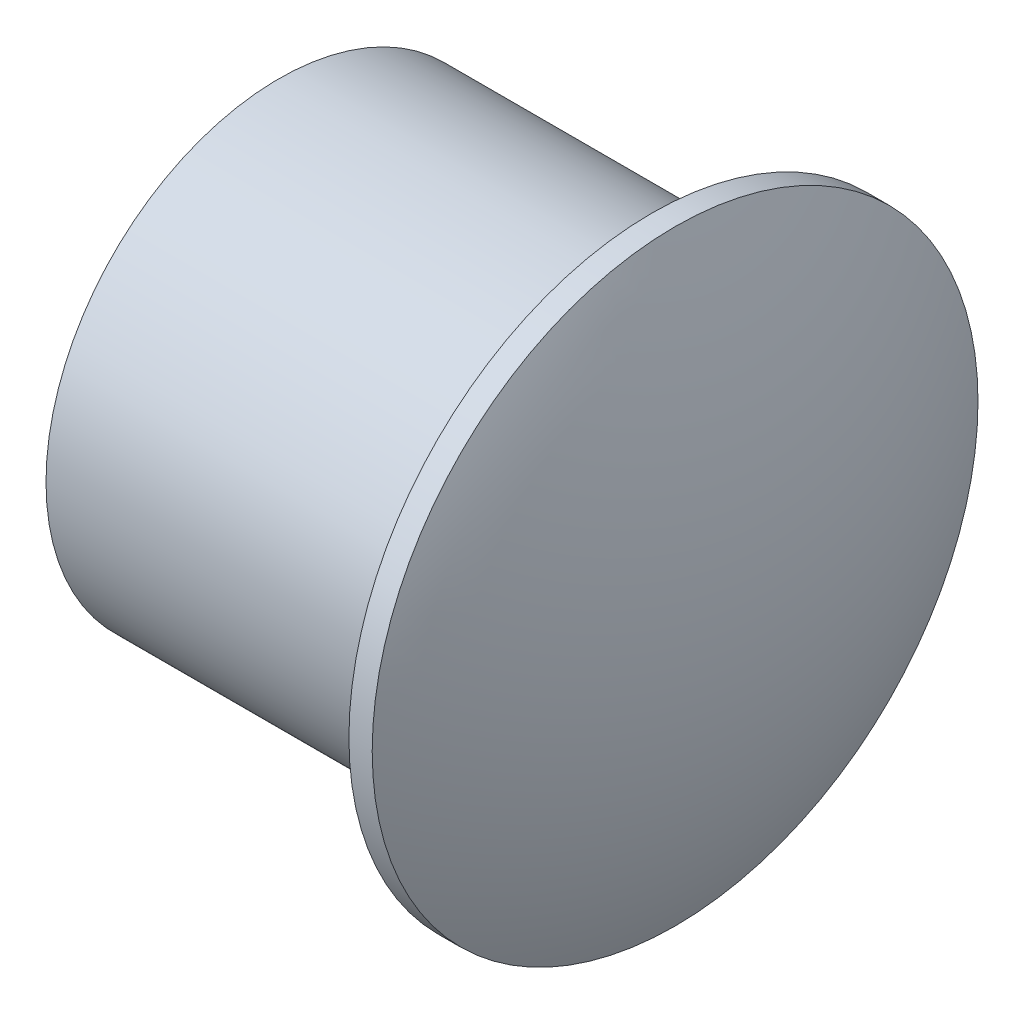
ISO-10303-21;
HEADER;
FILE_DESCRIPTION(('STEP AP214'),'2;1');
FILE_NAME('part.step','',(''),(''),'','','');
FILE_SCHEMA(('AUTOMOTIVE_DESIGN { 1 0 10303 214 1 1 1 1 }'));
ENDSEC;
DATA;
#1=APPLICATION_CONTEXT('core data for automotive mechanical design processes');
#2=APPLICATION_PROTOCOL_DEFINITION('international standard','automotive_design',2000,#1);
#3=PRODUCT_CONTEXT('',#1,'mechanical');
#4=PRODUCT('Part','Part','',(#3));
#5=PRODUCT_RELATED_PRODUCT_CATEGORY('part','',(#4));
#6=PRODUCT_DEFINITION_FORMATION('','',#4);
#7=PRODUCT_DEFINITION_CONTEXT('part definition',#1,'design');
#8=PRODUCT_DEFINITION('design','',#6,#7);
#9=PRODUCT_DEFINITION_SHAPE('','',#8);
#10=(LENGTH_UNIT() NAMED_UNIT(*) SI_UNIT(.MILLI.,.METRE.));
#11=(NAMED_UNIT(*) PLANE_ANGLE_UNIT() SI_UNIT($,.RADIAN.));
#12=(NAMED_UNIT(*) SI_UNIT($,.STERADIAN.) SOLID_ANGLE_UNIT());
#13=UNCERTAINTY_MEASURE_WITH_UNIT(LENGTH_MEASURE(1.E-05),#10,'distance_accuracy_value','');
#14=(GEOMETRIC_REPRESENTATION_CONTEXT(3) GLOBAL_UNCERTAINTY_ASSIGNED_CONTEXT((#13)) GLOBAL_UNIT_ASSIGNED_CONTEXT((#10,
#11,#12)) REPRESENTATION_CONTEXT('',''));
#15=CARTESIAN_POINT('',(0.,0.,0.));
#16=DIRECTION('',(0.,0.,1.));
#17=DIRECTION('',(1.,0.,0.));
#18=AXIS2_PLACEMENT_3D('',#15,#16,#17);
#19=CARTESIAN_POINT('',(-9.66666666666666,0.,0.));
#20=DIRECTION('',(-1.,0.,0.));
#21=DIRECTION('',(0.,1.,0.));
#22=AXIS2_PLACEMENT_3D('',#19,#20,#21);
#23=SPHERICAL_SURFACE('',#22,29.6666666666667);
#24=CARTESIAN_POINT('',(17.,0.,0.));
#25=DIRECTION('',(-1.,0.,0.));
#26=DIRECTION('',(0.,0.,1.));
#27=AXIS2_PLACEMENT_3D('',#24,#25,#26);
#28=CIRCLE('',#27,13.);
#29=CARTESIAN_POINT('',(17.,0.,13.));
#30=VERTEX_POINT('',#29);
#31=EDGE_CURVE('E10',#30,#30,#28,.T.);
#32=ORIENTED_EDGE('',*,*,#31,.F.);
#33=EDGE_LOOP('',(#32));
#34=FACE_BOUND('',#33,.T.);
#35=ADVANCED_FACE('F41',(#34),#23,.T.);
#36=CARTESIAN_POINT('',(0.,0.,0.));
#37=DIRECTION('',(-1.,0.,0.));
#38=DIRECTION('',(0.,0.,1.));
#39=AXIS2_PLACEMENT_3D('',#36,#37,#38);
#40=CYLINDRICAL_SURFACE('',#39,13.);
#41=CARTESIAN_POINT('',(16.,0.,0.));
#42=DIRECTION('',(-1.,0.,0.));
#43=DIRECTION('',(0.,0.,1.));
#44=AXIS2_PLACEMENT_3D('',#41,#42,#43);
#45=CIRCLE('',#44,13.);
#46=CARTESIAN_POINT('',(16.,0.,13.));
#47=VERTEX_POINT('',#46);
#48=EDGE_CURVE('E48',#47,#47,#45,.T.);
#49=ORIENTED_EDGE('',*,*,#48,.F.);
#50=EDGE_LOOP('',(#49));
#51=FACE_BOUND('',#50,.T.);
#52=ORIENTED_EDGE('',*,*,#31,.T.);
#53=EDGE_LOOP('',(#52));
#54=FACE_BOUND('',#53,.T.);
#55=ADVANCED_FACE('F75',(#51,#54),#40,.T.);
#56=CARTESIAN_POINT('',(16.,10.,0.));
#57=DIRECTION('',(1.,0.,0.));
#58=DIRECTION('',(0.,0.,-1.));
#59=AXIS2_PLACEMENT_3D('',#56,#57,#58);
#60=PLANE('',#59);
#61=CARTESIAN_POINT('',(16.,0.,0.));
#62=DIRECTION('',(-1.,0.,0.));
#63=DIRECTION('',(0.,0.,1.));
#64=AXIS2_PLACEMENT_3D('',#61,#62,#63);
#65=CIRCLE('',#64,10.);
#66=CARTESIAN_POINT('',(16.,0.,10.));
#67=VERTEX_POINT('',#66);
#68=EDGE_CURVE('E53',#67,#67,#65,.T.);
#69=ORIENTED_EDGE('',*,*,#68,.F.);
#70=EDGE_LOOP('',(#69));
#71=FACE_BOUND('',#70,.T.);
#72=ORIENTED_EDGE('',*,*,#48,.T.);
#73=EDGE_LOOP('',(#72));
#74=FACE_BOUND('',#73,.T.);
#75=ADVANCED_FACE('F70',(#71,#74),#60,.F.);
#76=CARTESIAN_POINT('',(0.,0.,0.));
#77=DIRECTION('',(-1.,0.,0.));
#78=DIRECTION('',(0.,0.,1.));
#79=AXIS2_PLACEMENT_3D('',#76,#77,#78);
#80=CYLINDRICAL_SURFACE('',#79,10.);
#81=CARTESIAN_POINT('',(0.,0.,0.));
#82=DIRECTION('',(-1.,0.,0.));
#83=DIRECTION('',(0.,0.,1.));
#84=AXIS2_PLACEMENT_3D('',#81,#82,#83);
#85=CIRCLE('',#84,10.);
#86=CARTESIAN_POINT('',(0.,0.,10.));
#87=VERTEX_POINT('',#86);
#88=EDGE_CURVE('E58',#87,#87,#85,.T.);
#89=ORIENTED_EDGE('',*,*,#88,.F.);
#90=EDGE_LOOP('',(#89));
#91=FACE_BOUND('',#90,.T.);
#92=ORIENTED_EDGE('',*,*,#68,.T.);
#93=EDGE_LOOP('',(#92));
#94=FACE_BOUND('',#93,.T.);
#95=ADVANCED_FACE('F67',(#91,#94),#80,.T.);
#96=CARTESIAN_POINT('',(0.,0.,0.));
#97=DIRECTION('',(1.,0.,0.));
#98=DIRECTION('',(0.,0.,-1.));
#99=AXIS2_PLACEMENT_3D('',#96,#97,#98);
#100=PLANE('',#99);
#101=ORIENTED_EDGE('',*,*,#88,.T.);
#102=EDGE_LOOP('',(#101));
#103=FACE_BOUND('',#102,.T.);
#104=ADVANCED_FACE('F65',(#103),#100,.F.);
#105=CLOSED_SHELL('',(#35,#55,#75,#95,#104));
#106=MANIFOLD_SOLID_BREP('B2',#105);
#107=ADVANCED_BREP_SHAPE_REPRESENTATION('',(#18,#106),#14);
#108=SHAPE_DEFINITION_REPRESENTATION(#9,#107);
ENDSEC;
END-ISO-10303-21;
